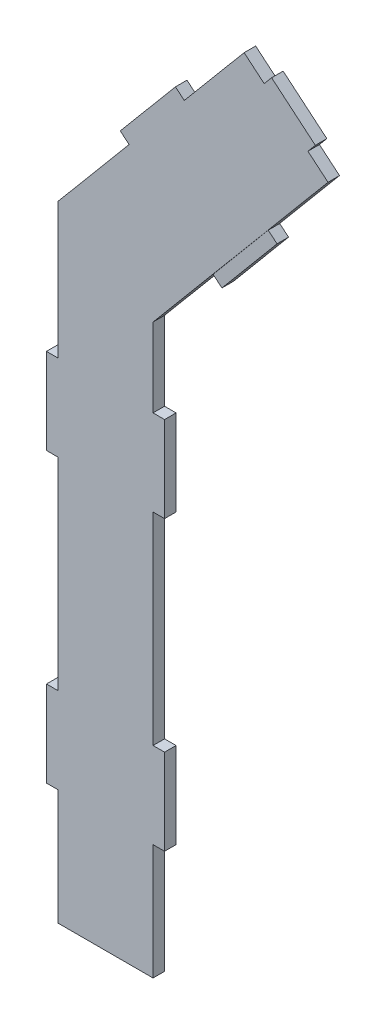
ISO-10303-21;
HEADER;
FILE_DESCRIPTION(('STEP AP214'),'2;1');
FILE_NAME('part.step','',(''),(''),'','','');
FILE_SCHEMA(('AUTOMOTIVE_DESIGN { 1 0 10303 214 1 1 1 1 }'));
ENDSEC;
DATA;
#1=APPLICATION_CONTEXT('core data for automotive mechanical design processes');
#2=APPLICATION_PROTOCOL_DEFINITION('international standard','automotive_design',2000,#1);
#3=PRODUCT_CONTEXT('',#1,'mechanical');
#4=PRODUCT('Part','Part','',(#3));
#5=PRODUCT_RELATED_PRODUCT_CATEGORY('part','',(#4));
#6=PRODUCT_DEFINITION_FORMATION('','',#4);
#7=PRODUCT_DEFINITION_CONTEXT('part definition',#1,'design');
#8=PRODUCT_DEFINITION('design','',#6,#7);
#9=PRODUCT_DEFINITION_SHAPE('','',#8);
#10=(LENGTH_UNIT() NAMED_UNIT(*) SI_UNIT(.MILLI.,.METRE.));
#11=(NAMED_UNIT(*) PLANE_ANGLE_UNIT() SI_UNIT($,.RADIAN.));
#12=(NAMED_UNIT(*) SI_UNIT($,.STERADIAN.) SOLID_ANGLE_UNIT());
#13=UNCERTAINTY_MEASURE_WITH_UNIT(LENGTH_MEASURE(1.E-05),#10,'distance_accuracy_value','');
#14=(GEOMETRIC_REPRESENTATION_CONTEXT(3) GLOBAL_UNCERTAINTY_ASSIGNED_CONTEXT((#13)) GLOBAL_UNIT_ASSIGNED_CONTEXT((#10,
#11,#12)) REPRESENTATION_CONTEXT('',''));
#15=CARTESIAN_POINT('',(0.,0.,0.));
#16=DIRECTION('',(0.,0.,1.));
#17=DIRECTION('',(1.,0.,0.));
#18=AXIS2_PLACEMENT_3D('',#15,#16,#17);
#19=CARTESIAN_POINT('',(75.2950598994498,89.9217180340493,2.));
#20=DIRECTION('',(0.641995610702937,0.766708312096695,0.));
#21=DIRECTION('',(-0.766708312096695,0.641995610702937,0.));
#22=AXIS2_PLACEMENT_3D('',#19,#20,#21);
#23=PLANE('',#22);
#24=DIRECTION('',(0.766708312096695,-0.641995610702937,0.));
#25=VECTOR('',#24,1.);
#26=CARTESIAN_POINT('',(75.2950598994498,89.9217180340493,0.));
#27=LINE('',#26,#25);
#28=CARTESIAN_POINT('',(36.4913656949544,122.413607016209,0.));
#29=VERTEX_POINT('',#28);
#30=CARTESIAN_POINT('',(38.0247823191478,121.129615794803,0.));
#31=VERTEX_POINT('',#30);
#32=EDGE_CURVE('E214',#29,#31,#27,.T.);
#33=ORIENTED_EDGE('',*,*,#32,.F.);
#34=DIRECTION('',(0.,0.,-1.));
#35=VECTOR('',#34,1.);
#36=CARTESIAN_POINT('',(36.4913656949544,122.413607016209,2.));
#37=LINE('',#36,#35);
#38=CARTESIAN_POINT('',(36.4913656949544,122.413607016209,2.));
#39=VERTEX_POINT('',#38);
#40=EDGE_CURVE('E13',#39,#29,#37,.T.);
#41=ORIENTED_EDGE('',*,*,#40,.F.);
#42=DIRECTION('',(0.766708312096695,-0.641995610702937,0.));
#43=VECTOR('',#42,1.);
#44=CARTESIAN_POINT('',(75.2950598994498,89.9217180340493,2.));
#45=LINE('',#44,#43);
#46=CARTESIAN_POINT('',(38.0247823191478,121.129615794803,2.));
#47=VERTEX_POINT('',#46);
#48=EDGE_CURVE('E202',#39,#47,#45,.T.);
#49=ORIENTED_EDGE('',*,*,#48,.T.);
#50=DIRECTION('',(0.,0.,-1.));
#51=VECTOR('',#50,1.);
#52=CARTESIAN_POINT('',(38.0247823191478,121.129615794803,2.));
#53=LINE('',#52,#51);
#54=EDGE_CURVE('E191',#47,#31,#53,.T.);
#55=ORIENTED_EDGE('',*,*,#54,.T.);
#56=EDGE_LOOP('',(#33,#41,#49,#55));
#57=FACE_BOUND('',#56,.T.);
#58=ADVANCED_FACE('F152',(#57),#23,.T.);
#59=CARTESIAN_POINT('',(-38.803694204496,32.4918889821611,2.));
#60=DIRECTION('',(0.766708312096689,-0.641995610702945,0.));
#61=DIRECTION('',(0.641995610702945,0.766708312096689,0.));
#62=AXIS2_PLACEMENT_3D('',#59,#60,#61);
#63=PLANE('',#62);
#64=DIRECTION('',(-0.641995610702945,-0.766708312096689,0.));
#65=VECTOR('',#64,1.);
#66=CARTESIAN_POINT('',(-38.803694204496,32.4918889821611,0.));
#67=LINE('',#66,#65);
#68=CARTESIAN_POINT('',(26.9256310954805,110.989653165969,0.));
#69=VERTEX_POINT('',#68);
#70=EDGE_CURVE('E207',#29,#69,#67,.T.);
#71=ORIENTED_EDGE('',*,*,#70,.T.);
#72=DIRECTION('',(0.,0.,-1.));
#73=VECTOR('',#72,1.);
#74=CARTESIAN_POINT('',(26.9256310954805,110.989653165969,2.));
#75=LINE('',#74,#73);
#76=CARTESIAN_POINT('',(26.9256310954805,110.989653165969,2.));
#77=VERTEX_POINT('',#76);
#78=EDGE_CURVE('E160',#77,#69,#75,.T.);
#79=ORIENTED_EDGE('',*,*,#78,.F.);
#80=DIRECTION('',(-0.641995610702945,-0.766708312096689,0.));
#81=VECTOR('',#80,1.);
#82=CARTESIAN_POINT('',(-38.803694204496,32.4918889821611,2.));
#83=LINE('',#82,#81);
#84=EDGE_CURVE('E197',#39,#77,#83,.T.);
#85=ORIENTED_EDGE('',*,*,#84,.F.);
#86=ORIENTED_EDGE('',*,*,#40,.T.);
#87=EDGE_LOOP('',(#71,#79,#85,#86));
#88=FACE_BOUND('',#87,.T.);
#89=ADVANCED_FACE('F205',(#88),#63,.F.);
#90=CARTESIAN_POINT('',(65.7293252999762,78.4977641838082,2.));
#91=DIRECTION('',(0.641995610702939,0.766708312096694,0.));
#92=DIRECTION('',(-0.766708312096694,0.641995610702939,0.));
#93=AXIS2_PLACEMENT_3D('',#90,#91,#92);
#94=PLANE('',#93);
#95=DIRECTION('',(0.766708312096693,-0.641995610702939,0.));
#96=VECTOR('',#95,1.);
#97=CARTESIAN_POINT('',(65.7293252999762,78.4977641838082,0.));
#98=LINE('',#97,#96);
#99=CARTESIAN_POINT('',(28.4590477196739,109.705661944563,0.));
#100=VERTEX_POINT('',#99);
#101=EDGE_CURVE('E184',#69,#100,#98,.T.);
#102=ORIENTED_EDGE('',*,*,#101,.T.);
#103=DIRECTION('',(0.,0.,-1.));
#104=VECTOR('',#103,1.);
#105=CARTESIAN_POINT('',(28.4590477196739,109.705661944563,2.));
#106=LINE('',#105,#104);
#107=CARTESIAN_POINT('',(28.4590477196739,109.705661944563,2.));
#108=VERTEX_POINT('',#107);
#109=EDGE_CURVE('E208',#108,#100,#106,.T.);
#110=ORIENTED_EDGE('',*,*,#109,.F.);
#111=DIRECTION('',(0.766708312096693,-0.641995610702939,0.));
#112=VECTOR('',#111,1.);
#113=CARTESIAN_POINT('',(65.7293252999762,78.4977641838082,2.));
#114=LINE('',#113,#112);
#115=EDGE_CURVE('E201',#77,#108,#114,.T.);
#116=ORIENTED_EDGE('',*,*,#115,.F.);
#117=ORIENTED_EDGE('',*,*,#78,.T.);
#118=EDGE_LOOP('',(#102,#110,#116,#117));
#119=FACE_BOUND('',#118,.T.);
#120=ADVANCED_FACE('F209',(#119),#94,.F.);
#121=CARTESIAN_POINT('',(-37.2702775803026,31.2078977607551,2.));
#122=DIRECTION('',(-0.766708312096689,0.641995610702944,0.));
#123=DIRECTION('',(-0.641995610702944,-0.766708312096689,0.));
#124=AXIS2_PLACEMENT_3D('',#121,#122,#123);
#125=PLANE('',#124);
#126=DIRECTION('',(0.641995610702944,0.766708312096689,0.));
#127=VECTOR('',#126,1.);
#128=CARTESIAN_POINT('',(-37.2702775803026,31.2078977607551,0.));
#129=LINE('',#128,#127);
#130=EDGE_CURVE('E219',#100,#31,#129,.T.);
#131=ORIENTED_EDGE('',*,*,#130,.T.);
#132=ORIENTED_EDGE('',*,*,#54,.F.);
#133=DIRECTION('',(0.641995610702944,0.766708312096689,0.));
#134=VECTOR('',#133,1.);
#135=CARTESIAN_POINT('',(-37.2702775803026,31.2078977607551,2.));
#136=LINE('',#135,#134);
#137=EDGE_CURVE('E168',#108,#47,#136,.T.);
#138=ORIENTED_EDGE('',*,*,#137,.F.);
#139=ORIENTED_EDGE('',*,*,#109,.T.);
#140=EDGE_LOOP('',(#131,#132,#138,#139));
#141=FACE_BOUND('',#140,.T.);
#142=ADVANCED_FACE('F224',(#141),#125,.F.);
#143=CARTESIAN_POINT('',(0.,0.,2.));
#144=DIRECTION('',(0.,0.,1.));
#145=DIRECTION('',(1.,0.,0.));
#146=AXIS2_PLACEMENT_3D('',#143,#144,#145);
#147=PLANE('',#146);
#148=ORIENTED_EDGE('',*,*,#48,.F.);
#149=ORIENTED_EDGE('',*,*,#84,.T.);
#150=ORIENTED_EDGE('',*,*,#115,.T.);
#151=ORIENTED_EDGE('',*,*,#137,.T.);
#152=EDGE_LOOP('',(#148,#149,#150,#151));
#153=FACE_BOUND('',#152,.T.);
#154=ADVANCED_FACE('F199',(#153),#147,.T.);
#155=CARTESIAN_POINT('',(0.,0.,0.));
#156=DIRECTION('',(0.,0.,1.));
#157=DIRECTION('',(1.,0.,0.));
#158=AXIS2_PLACEMENT_3D('',#155,#156,#157);
#159=PLANE('',#158);
#160=ORIENTED_EDGE('',*,*,#32,.T.);
#161=ORIENTED_EDGE('',*,*,#130,.F.);
#162=ORIENTED_EDGE('',*,*,#101,.F.);
#163=ORIENTED_EDGE('',*,*,#70,.F.);
#164=EDGE_LOOP('',(#160,#161,#162,#163));
#165=FACE_BOUND('',#164,.T.);
#166=ADVANCED_FACE('F226',(#165),#159,.F.);
#167=CLOSED_SHELL('',(#58,#89,#120,#142,#154,#166));
#168=MANIFOLD_SOLID_BREP('B2',#167);
#169=CARTESIAN_POINT('',(85.7090829484666,102.251361125689,2.));
#170=DIRECTION('',(0.642391695952787,0.766376479917607,0.));
#171=DIRECTION('',(-0.766376479917607,0.642391695952787,0.));
#172=AXIS2_PLACEMENT_3D('',#169,#170,#171);
#173=PLANE('',#172);
#174=DIRECTION('',(0.766376479917607,-0.642391695952787,0.));
#175=VECTOR('',#174,1.);
#176=CARTESIAN_POINT('',(85.7090829484666,102.251361125689,0.));
#177=LINE('',#176,#175);
#178=CARTESIAN_POINT('',(43.3847015740639,137.728482153957,0.));
#179=VERTEX_POINT('',#178);
#180=CARTESIAN_POINT('',(46.871714557689,134.805599937372,0.));
#181=VERTEX_POINT('',#180);
#182=EDGE_CURVE('E515',#179,#181,#177,.T.);
#183=ORIENTED_EDGE('',*,*,#182,.F.);
#184=DIRECTION('',(0.,0.,-1.));
#185=VECTOR('',#184,1.);
#186=CARTESIAN_POINT('',(43.3847015740639,137.728482153957,2.));
#187=LINE('',#186,#185);
#188=CARTESIAN_POINT('',(43.3847015740639,137.728482153957,2.));
#189=VERTEX_POINT('',#188);
#190=EDGE_CURVE('E150',#189,#179,#187,.T.);
#191=ORIENTED_EDGE('',*,*,#190,.F.);
#192=DIRECTION('',(0.766376479917607,-0.642391695952787,0.));
#193=VECTOR('',#192,1.);
#194=CARTESIAN_POINT('',(85.7090829484666,102.251361125689,2.));
#195=LINE('',#194,#193);
#196=CARTESIAN_POINT('',(46.871714557689,134.805599937372,2.));
#197=VERTEX_POINT('',#196);
#198=EDGE_CURVE('E593',#189,#197,#195,.T.);
#199=ORIENTED_EDGE('',*,*,#198,.T.);
#200=DIRECTION('',(0.,0.,-1.));
#201=VECTOR('',#200,1.);
#202=CARTESIAN_POINT('',(46.871714557689,134.805599937372,2.));
#203=LINE('',#202,#201);
#204=EDGE_CURVE('E403',#197,#181,#203,.T.);
#205=ORIENTED_EDGE('',*,*,#204,.T.);
#206=EDGE_LOOP('',(#183,#191,#199,#205));
#207=FACE_BOUND('',#206,.T.);
#208=ADVANCED_FACE('F287',(#207),#173,.T.);
#209=CARTESIAN_POINT('',(-42.324381374403,35.4771210282688,2.));
#210=DIRECTION('',(-0.766376479917604,0.64239169595279,0.));
#211=DIRECTION('',(-0.64239169595279,-0.766376479917604,0.));
#212=AXIS2_PLACEMENT_3D('',#209,#210,#211);
#213=PLANE('',#212);
#214=DIRECTION('',(0.64239169595279,0.766376479917604,0.));
#215=VECTOR('',#214,1.);
#216=CARTESIAN_POINT('',(-42.324381374403,35.4771210282688,0.));
#217=LINE('',#216,#215);
#218=CARTESIAN_POINT('',(44.6694849659695,139.261235113792,0.));
#219=VERTEX_POINT('',#218);
#220=EDGE_CURVE('E518',#179,#219,#217,.T.);
#221=ORIENTED_EDGE('',*,*,#220,.T.);
#222=DIRECTION('',(0.,0.,-1.));
#223=VECTOR('',#222,1.);
#224=CARTESIAN_POINT('',(44.6694849659695,139.261235113792,2.));
#225=LINE('',#224,#223);
#226=CARTESIAN_POINT('',(44.6694849659695,139.261235113792,2.));
#227=VERTEX_POINT('',#226);
#228=EDGE_CURVE('E295',#227,#219,#225,.T.);
#229=ORIENTED_EDGE('',*,*,#228,.F.);
#230=DIRECTION('',(0.64239169595279,0.766376479917604,0.));
#231=VECTOR('',#230,1.);
#232=CARTESIAN_POINT('',(-42.324381374403,35.4771210282688,2.));
#233=LINE('',#232,#231);
#234=EDGE_CURVE('E670',#189,#227,#233,.T.);
#235=ORIENTED_EDGE('',*,*,#234,.F.);
#236=ORIENTED_EDGE('',*,*,#190,.T.);
#237=EDGE_LOOP('',(#221,#229,#235,#236));
#238=FACE_BOUND('',#237,.T.);
#239=ADVANCED_FACE('F658',(#238),#213,.F.);
#240=CARTESIAN_POINT('',(86.9938663403723,103.784114085524,2.));
#241=DIRECTION('',(0.642391695952788,0.766376479917606,0.));
#242=DIRECTION('',(-0.766376479917606,0.642391695952788,0.));
#243=AXIS2_PLACEMENT_3D('',#240,#241,#242);
#244=PLANE('',#243);
#245=DIRECTION('',(0.766376479917606,-0.642391695952788,0.));
#246=VECTOR('',#245,1.);
#247=CARTESIAN_POINT('',(86.9938663403723,103.784114085524,0.));
#248=LINE('',#247,#246);
#249=CARTESIAN_POINT('',(37.0823578147852,145.620912903725,0.));
#250=VERTEX_POINT('',#249);
#251=EDGE_CURVE('E521',#250,#219,#248,.T.);
#252=ORIENTED_EDGE('',*,*,#251,.F.);
#253=DIRECTION('',(0.,0.,-1.));
#254=VECTOR('',#253,1.);
#255=CARTESIAN_POINT('',(37.0823578147852,145.620912903725,2.));
#256=LINE('',#255,#254);
#257=CARTESIAN_POINT('',(37.0823578147852,145.620912903725,2.));
#258=VERTEX_POINT('',#257);
#259=EDGE_CURVE('E648',#258,#250,#256,.T.);
#260=ORIENTED_EDGE('',*,*,#259,.F.);
#261=DIRECTION('',(0.766376479917606,-0.642391695952788,0.));
#262=VECTOR('',#261,1.);
#263=CARTESIAN_POINT('',(86.9938663403723,103.784114085524,2.));
#264=LINE('',#263,#262);
#265=EDGE_CURVE('E655',#258,#227,#264,.T.);
#266=ORIENTED_EDGE('',*,*,#265,.T.);
#267=ORIENTED_EDGE('',*,*,#228,.T.);
#268=EDGE_LOOP('',(#252,#260,#266,#267));
#269=FACE_BOUND('',#268,.T.);
#270=ADVANCED_FACE('F653',(#269),#244,.T.);
#271=CARTESIAN_POINT('',(-49.9115085255874,41.8367988182018,2.));
#272=DIRECTION('',(-0.766376479917602,0.642391695952792,0.));
#273=DIRECTION('',(-0.642391695952792,-0.766376479917602,0.));
#274=AXIS2_PLACEMENT_3D('',#271,#272,#273);
#275=PLANE('',#274);
#276=DIRECTION('',(0.642391695952792,0.766376479917602,0.));
#277=VECTOR('',#276,1.);
#278=CARTESIAN_POINT('',(-49.9115085255874,41.8367988182018,0.));
#279=LINE('',#278,#277);
#280=CARTESIAN_POINT('',(35.7975744228796,144.088159943889,0.));
#281=VERTEX_POINT('',#280);
#282=EDGE_CURVE('E524',#281,#250,#279,.T.);
#283=ORIENTED_EDGE('',*,*,#282,.F.);
#284=DIRECTION('',(0.,0.,-1.));
#285=VECTOR('',#284,1.);
#286=CARTESIAN_POINT('',(35.7975744228796,144.088159943889,2.));
#287=LINE('',#286,#285);
#288=CARTESIAN_POINT('',(35.7975744228796,144.088159943889,2.));
#289=VERTEX_POINT('',#288);
#290=EDGE_CURVE('E646',#289,#281,#287,.T.);
#291=ORIENTED_EDGE('',*,*,#290,.F.);
#292=DIRECTION('',(0.642391695952792,0.766376479917602,0.));
#293=VECTOR('',#292,1.);
#294=CARTESIAN_POINT('',(-49.9115085255874,41.8367988182018,2.));
#295=LINE('',#294,#293);
#296=EDGE_CURVE('E667',#289,#258,#295,.T.);
#297=ORIENTED_EDGE('',*,*,#296,.T.);
#298=ORIENTED_EDGE('',*,*,#259,.T.);
#299=EDGE_LOOP('',(#283,#291,#297,#298));
#300=FACE_BOUND('',#299,.T.);
#301=ADVANCED_FACE('F664',(#300),#275,.T.);
#302=CARTESIAN_POINT('',(85.7090829484668,102.251361125688,2.));
#303=DIRECTION('',(0.64239169595279,0.766376479917604,0.));
#304=DIRECTION('',(-0.766376479917604,0.64239169595279,0.));
#305=AXIS2_PLACEMENT_3D('',#302,#303,#304);
#306=PLANE('',#305);
#307=DIRECTION('',(0.766376479917604,-0.64239169595279,0.));
#308=VECTOR('',#307,1.);
#309=CARTESIAN_POINT('',(85.7090829484668,102.251361125688,0.));
#310=LINE('',#309,#308);
#311=CARTESIAN_POINT('',(32.3129331389424,147.009054155591,0.));
#312=VERTEX_POINT('',#311);
#313=EDGE_CURVE('E527',#312,#281,#310,.T.);
#314=ORIENTED_EDGE('',*,*,#313,.F.);
#315=DIRECTION('',(0.,0.,-1.));
#316=VECTOR('',#315,1.);
#317=CARTESIAN_POINT('',(32.3129331389424,147.009054155591,2.));
#318=LINE('',#317,#316);
#319=CARTESIAN_POINT('',(32.3129331389424,147.009054155591,2.));
#320=VERTEX_POINT('',#319);
#321=EDGE_CURVE('E644',#320,#312,#318,.T.);
#322=ORIENTED_EDGE('',*,*,#321,.F.);
#323=DIRECTION('',(0.766376479917604,-0.64239169595279,0.));
#324=VECTOR('',#323,1.);
#325=CARTESIAN_POINT('',(85.7090829484668,102.251361125688,2.));
#326=LINE('',#325,#324);
#327=EDGE_CURVE('E672',#320,#289,#326,.T.);
#328=ORIENTED_EDGE('',*,*,#327,.T.);
#329=ORIENTED_EDGE('',*,*,#290,.T.);
#330=EDGE_LOOP('',(#314,#322,#328,#329));
#331=FACE_BOUND('',#330,.T.);
#332=ADVANCED_FACE('F753',(#331),#306,.T.);
#333=CARTESIAN_POINT('',(-53.4258206009123,44.8295863615691,2.));
#334=DIRECTION('',(-0.766044443118978,0.64278760968654,0.));
#335=DIRECTION('',(-0.64278760968654,-0.766044443118978,0.));
#336=AXIS2_PLACEMENT_3D('',#333,#334,#335);
#337=PLANE('',#336);
#338=DIRECTION('',(0.64278760968654,0.766044443118978,0.));
#339=VECTOR('',#338,1.);
#340=CARTESIAN_POINT('',(-53.4258206009123,44.8295863615691,0.));
#341=LINE('',#340,#339);
#342=CARTESIAN_POINT('',(21.9221531666117,134.62580479371,0.));
#343=VERTEX_POINT('',#342);
#344=EDGE_CURVE('E530',#343,#312,#341,.T.);
#345=ORIENTED_EDGE('',*,*,#344,.F.);
#346=DIRECTION('',(0.,0.,-1.));
#347=VECTOR('',#346,1.);
#348=CARTESIAN_POINT('',(21.9221531666117,134.62580479371,2.));
#349=LINE('',#348,#347);
#350=CARTESIAN_POINT('',(21.9221531666117,134.62580479371,2.));
#351=VERTEX_POINT('',#350);
#352=EDGE_CURVE('E642',#351,#343,#349,.T.);
#353=ORIENTED_EDGE('',*,*,#352,.F.);
#354=DIRECTION('',(0.64278760968654,0.766044443118978,0.));
#355=VECTOR('',#354,1.);
#356=CARTESIAN_POINT('',(-53.4258206009123,44.8295863615691,2.));
#357=LINE('',#356,#355);
#358=EDGE_CURVE('E678',#351,#320,#357,.T.);
#359=ORIENTED_EDGE('',*,*,#358,.T.);
#360=ORIENTED_EDGE('',*,*,#321,.T.);
#361=EDGE_LOOP('',(#345,#353,#359,#360));
#362=FACE_BOUND('',#361,.T.);
#363=ADVANCED_FACE('F756',(#362),#337,.T.);
#364=CARTESIAN_POINT('',(75.3479737675246,89.7962184321393,2.));
#365=DIRECTION('',(-0.642787609686549,-0.76604444311897,0.));
#366=DIRECTION('',(0.76604444311897,-0.642787609686549,0.));
#367=AXIS2_PLACEMENT_3D('',#364,#365,#366);
#368=PLANE('',#367);
#369=DIRECTION('',(-0.76604444311897,0.642787609686549,0.));
#370=VECTOR('',#369,1.);
#371=CARTESIAN_POINT('',(75.3479737675246,89.7962184321393,0.));
#372=LINE('',#371,#370);
#373=CARTESIAN_POINT('',(20.3900642803738,135.911380013083,0.));
#374=VERTEX_POINT('',#373);
#375=EDGE_CURVE('E533',#343,#374,#372,.T.);
#376=ORIENTED_EDGE('',*,*,#375,.T.);
#377=DIRECTION('',(0.,0.,-1.));
#378=VECTOR('',#377,1.);
#379=CARTESIAN_POINT('',(20.3900642803738,135.911380013083,2.));
#380=LINE('',#379,#378);
#381=CARTESIAN_POINT('',(20.3900642803738,135.911380013083,2.));
#382=VERTEX_POINT('',#381);
#383=EDGE_CURVE('E640',#382,#374,#380,.T.);
#384=ORIENTED_EDGE('',*,*,#383,.F.);
#385=DIRECTION('',(-0.76604444311897,0.642787609686549,0.));
#386=VECTOR('',#385,1.);
#387=CARTESIAN_POINT('',(75.3479737675246,89.7962184321393,2.));
#388=LINE('',#387,#386);
#389=EDGE_CURVE('E681',#351,#382,#388,.T.);
#390=ORIENTED_EDGE('',*,*,#389,.F.);
#391=ORIENTED_EDGE('',*,*,#352,.T.);
#392=EDGE_LOOP('',(#376,#384,#390,#391));
#393=FACE_BOUND('',#392,.T.);
#394=ADVANCED_FACE('F760',(#393),#368,.F.);
#395=CARTESIAN_POINT('',(-54.9579094871503,46.1151615809423,2.));
#396=DIRECTION('',(-0.766044443118977,0.642787609686541,0.));
#397=DIRECTION('',(-0.642787609686541,-0.766044443118977,0.));
#398=AXIS2_PLACEMENT_3D('',#395,#396,#397);
#399=PLANE('',#398);
#400=DIRECTION('',(0.64278760968654,0.766044443118977,0.));
#401=VECTOR('',#400,1.);
#402=CARTESIAN_POINT('',(-54.9579094871503,46.1151615809423,0.));
#403=LINE('',#402,#401);
#404=CARTESIAN_POINT('',(10.8125288960443,124.49731781061,0.));
#405=VERTEX_POINT('',#404);
#406=EDGE_CURVE('E536',#405,#374,#403,.T.);
#407=ORIENTED_EDGE('',*,*,#406,.F.);
#408=DIRECTION('',(0.,0.,-1.));
#409=VECTOR('',#408,1.);
#410=CARTESIAN_POINT('',(10.8125288960443,124.49731781061,2.));
#411=LINE('',#410,#409);
#412=CARTESIAN_POINT('',(10.8125288960443,124.49731781061,2.));
#413=VERTEX_POINT('',#412);
#414=EDGE_CURVE('E638',#413,#405,#411,.T.);
#415=ORIENTED_EDGE('',*,*,#414,.F.);
#416=DIRECTION('',(0.64278760968654,0.766044443118977,0.));
#417=VECTOR('',#416,1.);
#418=CARTESIAN_POINT('',(-54.9579094871503,46.1151615809423,2.));
#419=LINE('',#418,#417);
#420=EDGE_CURVE('E683',#413,#382,#419,.T.);
#421=ORIENTED_EDGE('',*,*,#420,.T.);
#422=ORIENTED_EDGE('',*,*,#383,.T.);
#423=EDGE_LOOP('',(#407,#415,#421,#422));
#424=FACE_BOUND('',#423,.T.);
#425=ADVANCED_FACE('F764',(#424),#399,.T.);
#426=CARTESIAN_POINT('',(65.7704383831946,78.382156229668,2.));
#427=DIRECTION('',(-0.642787609686541,-0.766044443118977,0.));
#428=DIRECTION('',(0.766044443118977,-0.642787609686541,0.));
#429=AXIS2_PLACEMENT_3D('',#426,#427,#428);
#430=PLANE('',#429);
#431=DIRECTION('',(-0.766044443118977,0.642787609686541,0.));
#432=VECTOR('',#431,1.);
#433=CARTESIAN_POINT('',(65.7704383831946,78.382156229668,0.));
#434=LINE('',#433,#432);
#435=CARTESIAN_POINT('',(12.3446177822823,123.211742591237,0.));
#436=VERTEX_POINT('',#435);
#437=EDGE_CURVE('E539',#436,#405,#434,.T.);
#438=ORIENTED_EDGE('',*,*,#437,.F.);
#439=DIRECTION('',(0.,0.,-1.));
#440=VECTOR('',#439,1.);
#441=CARTESIAN_POINT('',(12.3446177822823,123.211742591237,2.));
#442=LINE('',#441,#440);
#443=CARTESIAN_POINT('',(12.3446177822823,123.211742591237,2.));
#444=VERTEX_POINT('',#443);
#445=EDGE_CURVE('E636',#444,#436,#442,.T.);
#446=ORIENTED_EDGE('',*,*,#445,.F.);
#447=DIRECTION('',(-0.766044443118977,0.642787609686541,0.));
#448=VECTOR('',#447,1.);
#449=CARTESIAN_POINT('',(65.7704383831946,78.382156229668,2.));
#450=LINE('',#449,#448);
#451=EDGE_CURVE('E686',#444,#413,#450,.T.);
#452=ORIENTED_EDGE('',*,*,#451,.T.);
#453=ORIENTED_EDGE('',*,*,#414,.T.);
#454=EDGE_LOOP('',(#438,#446,#452,#453));
#455=FACE_BOUND('',#454,.T.);
#456=ADVANCED_FACE('F768',(#455),#430,.T.);
#457=CARTESIAN_POINT('',(-53.4258206009123,44.8295863615693,2.));
#458=DIRECTION('',(-0.766044443118976,0.642787609686541,0.));
#459=DIRECTION('',(-0.642787609686541,-0.766044443118976,0.));
#460=AXIS2_PLACEMENT_3D('',#457,#458,#459);
#461=PLANE('',#460);
#462=DIRECTION('',(0.642787609686541,0.766044443118976,0.));
#463=VECTOR('',#462,1.);
#464=CARTESIAN_POINT('',(-53.4258206009123,44.8295863615693,0.));
#465=LINE('',#464,#463);
#466=CARTESIAN_POINT('',(0.,108.5,0.));
#467=VERTEX_POINT('',#466);
#468=EDGE_CURVE('E542',#467,#436,#465,.T.);
#469=ORIENTED_EDGE('',*,*,#468,.F.);
#470=DIRECTION('',(0.,0.,-1.));
#471=VECTOR('',#470,1.);
#472=CARTESIAN_POINT('',(0.,108.5,2.));
#473=LINE('',#472,#471);
#474=CARTESIAN_POINT('',(0.,108.5,2.));
#475=VERTEX_POINT('',#474);
#476=EDGE_CURVE('E634',#475,#467,#473,.T.);
#477=ORIENTED_EDGE('',*,*,#476,.F.);
#478=DIRECTION('',(0.642787609686541,0.766044443118976,0.));
#479=VECTOR('',#478,1.);
#480=CARTESIAN_POINT('',(-53.4258206009123,44.8295863615693,2.));
#481=LINE('',#480,#479);
#482=EDGE_CURVE('E689',#475,#444,#481,.T.);
#483=ORIENTED_EDGE('',*,*,#482,.T.);
#484=ORIENTED_EDGE('',*,*,#445,.T.);
#485=EDGE_LOOP('',(#469,#477,#483,#484));
#486=FACE_BOUND('',#485,.T.);
#487=ADVANCED_FACE('F772',(#486),#461,.T.);
#488=CARTESIAN_POINT('',(0.,0.,2.));
#489=DIRECTION('',(-1.,0.,0.));
#490=DIRECTION('',(0.,-1.,0.));
#491=AXIS2_PLACEMENT_3D('',#488,#489,#490);
#492=PLANE('',#491);
#493=DIRECTION('',(0.,1.,0.));
#494=VECTOR('',#493,1.);
#495=CARTESIAN_POINT('',(0.,0.,0.));
#496=LINE('',#495,#494);
#497=CARTESIAN_POINT('',(0.,84.95,0.));
#498=VERTEX_POINT('',#497);
#499=EDGE_CURVE('E545',#498,#467,#496,.T.);
#500=ORIENTED_EDGE('',*,*,#499,.F.);
#501=DIRECTION('',(0.,0.,-1.));
#502=VECTOR('',#501,1.);
#503=CARTESIAN_POINT('',(0.,84.95,2.));
#504=LINE('',#503,#502);
#505=CARTESIAN_POINT('',(0.,84.95,2.));
#506=VERTEX_POINT('',#505);
#507=EDGE_CURVE('E632',#506,#498,#504,.T.);
#508=ORIENTED_EDGE('',*,*,#507,.F.);
#509=DIRECTION('',(0.,1.,0.));
#510=VECTOR('',#509,1.);
#511=CARTESIAN_POINT('',(0.,0.,2.));
#512=LINE('',#511,#510);
#513=EDGE_CURVE('E692',#506,#475,#512,.T.);
#514=ORIENTED_EDGE('',*,*,#513,.T.);
#515=ORIENTED_EDGE('',*,*,#476,.T.);
#516=EDGE_LOOP('',(#500,#508,#514,#515));
#517=FACE_BOUND('',#516,.T.);
#518=ADVANCED_FACE('F776',(#517),#492,.T.);
#519=CARTESIAN_POINT('',(0.,84.95,2.));
#520=DIRECTION('',(0.,-1.,0.));
#521=DIRECTION('',(0.,0.,-1.));
#522=AXIS2_PLACEMENT_3D('',#519,#520,#521);
#523=PLANE('',#522);
#524=DIRECTION('',(-1.,0.,0.));
#525=VECTOR('',#524,1.);
#526=CARTESIAN_POINT('',(0.,84.95,0.));
#527=LINE('',#526,#525);
#528=CARTESIAN_POINT('',(-2.,84.95,0.));
#529=VERTEX_POINT('',#528);
#530=EDGE_CURVE('E548',#498,#529,#527,.T.);
#531=ORIENTED_EDGE('',*,*,#530,.T.);
#532=DIRECTION('',(0.,0.,-1.));
#533=VECTOR('',#532,1.);
#534=CARTESIAN_POINT('',(-2.,84.95,2.));
#535=LINE('',#534,#533);
#536=CARTESIAN_POINT('',(-2.,84.95,2.));
#537=VERTEX_POINT('',#536);
#538=EDGE_CURVE('E630',#537,#529,#535,.T.);
#539=ORIENTED_EDGE('',*,*,#538,.F.);
#540=DIRECTION('',(-1.,0.,0.));
#541=VECTOR('',#540,1.);
#542=CARTESIAN_POINT('',(0.,84.95,2.));
#543=LINE('',#542,#541);
#544=EDGE_CURVE('E695',#506,#537,#543,.T.);
#545=ORIENTED_EDGE('',*,*,#544,.F.);
#546=ORIENTED_EDGE('',*,*,#507,.T.);
#547=EDGE_LOOP('',(#531,#539,#545,#546));
#548=FACE_BOUND('',#547,.T.);
#549=ADVANCED_FACE('F780',(#548),#523,.F.);
#550=CARTESIAN_POINT('',(-1.99999999999999,0.,2.));
#551=DIRECTION('',(-1.,0.,0.));
#552=DIRECTION('',(0.,-1.,0.));
#553=AXIS2_PLACEMENT_3D('',#550,#551,#552);
#554=PLANE('',#553);
#555=DIRECTION('',(0.,1.,0.));
#556=VECTOR('',#555,1.);
#557=CARTESIAN_POINT('',(-1.99999999999999,0.,0.));
#558=LINE('',#557,#556);
#559=CARTESIAN_POINT('',(-2.,70.05,0.));
#560=VERTEX_POINT('',#559);
#561=EDGE_CURVE('E551',#560,#529,#558,.T.);
#562=ORIENTED_EDGE('',*,*,#561,.F.);
#563=DIRECTION('',(0.,0.,-1.));
#564=VECTOR('',#563,1.);
#565=CARTESIAN_POINT('',(-2.,70.05,2.));
#566=LINE('',#565,#564);
#567=CARTESIAN_POINT('',(-2.,70.05,2.));
#568=VERTEX_POINT('',#567);
#569=EDGE_CURVE('E628',#568,#560,#566,.T.);
#570=ORIENTED_EDGE('',*,*,#569,.F.);
#571=DIRECTION('',(0.,1.,0.));
#572=VECTOR('',#571,1.);
#573=CARTESIAN_POINT('',(-1.99999999999999,0.,2.));
#574=LINE('',#573,#572);
#575=EDGE_CURVE('E697',#568,#537,#574,.T.);
#576=ORIENTED_EDGE('',*,*,#575,.T.);
#577=ORIENTED_EDGE('',*,*,#538,.T.);
#578=EDGE_LOOP('',(#562,#570,#576,#577));
#579=FACE_BOUND('',#578,.T.);
#580=ADVANCED_FACE('F784',(#579),#554,.T.);
#581=CARTESIAN_POINT('',(0.,70.05,2.));
#582=DIRECTION('',(0.,-1.,0.));
#583=DIRECTION('',(0.,0.,-1.));
#584=AXIS2_PLACEMENT_3D('',#581,#582,#583);
#585=PLANE('',#584);
#586=DIRECTION('',(-1.,0.,0.));
#587=VECTOR('',#586,1.);
#588=CARTESIAN_POINT('',(0.,70.05,0.));
#589=LINE('',#588,#587);
#590=CARTESIAN_POINT('',(0.,70.05,0.));
#591=VERTEX_POINT('',#590);
#592=EDGE_CURVE('E554',#591,#560,#589,.T.);
#593=ORIENTED_EDGE('',*,*,#592,.F.);
#594=DIRECTION('',(0.,0.,-1.));
#595=VECTOR('',#594,1.);
#596=CARTESIAN_POINT('',(0.,70.05,2.));
#597=LINE('',#596,#595);
#598=CARTESIAN_POINT('',(0.,70.05,2.));
#599=VERTEX_POINT('',#598);
#600=EDGE_CURVE('E626',#599,#591,#597,.T.);
#601=ORIENTED_EDGE('',*,*,#600,.F.);
#602=DIRECTION('',(-1.,0.,0.));
#603=VECTOR('',#602,1.);
#604=CARTESIAN_POINT('',(0.,70.05,2.));
#605=LINE('',#604,#603);
#606=EDGE_CURVE('E700',#599,#568,#605,.T.);
#607=ORIENTED_EDGE('',*,*,#606,.T.);
#608=ORIENTED_EDGE('',*,*,#569,.T.);
#609=EDGE_LOOP('',(#593,#601,#607,#608));
#610=FACE_BOUND('',#609,.T.);
#611=ADVANCED_FACE('F788',(#610),#585,.T.);
#612=CARTESIAN_POINT('',(0.,0.,2.));
#613=DIRECTION('',(-1.,0.,0.));
#614=DIRECTION('',(0.,-1.,0.));
#615=AXIS2_PLACEMENT_3D('',#612,#613,#614);
#616=PLANE('',#615);
#617=DIRECTION('',(0.,1.,0.));
#618=VECTOR('',#617,1.);
#619=CARTESIAN_POINT('',(0.,0.,0.));
#620=LINE('',#619,#618);
#621=CARTESIAN_POINT('',(0.,34.95,0.));
#622=VERTEX_POINT('',#621);
#623=EDGE_CURVE('E557',#622,#591,#620,.T.);
#624=ORIENTED_EDGE('',*,*,#623,.F.);
#625=DIRECTION('',(0.,0.,-1.));
#626=VECTOR('',#625,1.);
#627=CARTESIAN_POINT('',(0.,34.95,2.));
#628=LINE('',#627,#626);
#629=CARTESIAN_POINT('',(0.,34.95,2.));
#630=VERTEX_POINT('',#629);
#631=EDGE_CURVE('E624',#630,#622,#628,.T.);
#632=ORIENTED_EDGE('',*,*,#631,.F.);
#633=DIRECTION('',(0.,1.,0.));
#634=VECTOR('',#633,1.);
#635=CARTESIAN_POINT('',(0.,0.,2.));
#636=LINE('',#635,#634);
#637=EDGE_CURVE('E703',#630,#599,#636,.T.);
#638=ORIENTED_EDGE('',*,*,#637,.T.);
#639=ORIENTED_EDGE('',*,*,#600,.T.);
#640=EDGE_LOOP('',(#624,#632,#638,#639));
#641=FACE_BOUND('',#640,.T.);
#642=ADVANCED_FACE('F792',(#641),#616,.T.);
#643=CARTESIAN_POINT('',(-1.21257170970779E-13,34.95,2.));
#644=DIRECTION('',(0.,-1.,0.));
#645=DIRECTION('',(1.,0.,0.));
#646=AXIS2_PLACEMENT_3D('',#643,#644,#645);
#647=PLANE('',#646);
#648=DIRECTION('',(-1.,0.,0.));
#649=VECTOR('',#648,1.);
#650=CARTESIAN_POINT('',(-1.21257170970779E-13,34.95,0.));
#651=LINE('',#650,#649);
#652=CARTESIAN_POINT('',(-2.,34.95,0.));
#653=VERTEX_POINT('',#652);
#654=EDGE_CURVE('E560',#622,#653,#651,.T.);
#655=ORIENTED_EDGE('',*,*,#654,.T.);
#656=DIRECTION('',(0.,0.,-1.));
#657=VECTOR('',#656,1.);
#658=CARTESIAN_POINT('',(-2.,34.95,2.));
#659=LINE('',#658,#657);
#660=CARTESIAN_POINT('',(-2.,34.95,2.));
#661=VERTEX_POINT('',#660);
#662=EDGE_CURVE('E622',#661,#653,#659,.T.);
#663=ORIENTED_EDGE('',*,*,#662,.F.);
#664=DIRECTION('',(-1.,0.,0.));
#665=VECTOR('',#664,1.);
#666=CARTESIAN_POINT('',(-1.21257170970779E-13,34.95,2.));
#667=LINE('',#666,#665);
#668=EDGE_CURVE('E706',#630,#661,#667,.T.);
#669=ORIENTED_EDGE('',*,*,#668,.F.);
#670=ORIENTED_EDGE('',*,*,#631,.T.);
#671=EDGE_LOOP('',(#655,#663,#669,#670));
#672=FACE_BOUND('',#671,.T.);
#673=ADVANCED_FACE('F796',(#672),#647,.F.);
#674=CARTESIAN_POINT('',(-2.,0.,2.));
#675=DIRECTION('',(-1.,0.,0.));
#676=DIRECTION('',(0.,-1.,0.));
#677=AXIS2_PLACEMENT_3D('',#674,#675,#676);
#678=PLANE('',#677);
#679=DIRECTION('',(0.,1.,0.));
#680=VECTOR('',#679,1.);
#681=CARTESIAN_POINT('',(-2.,0.,0.));
#682=LINE('',#681,#680);
#683=CARTESIAN_POINT('',(-2.,20.05,0.));
#684=VERTEX_POINT('',#683);
#685=EDGE_CURVE('E563',#684,#653,#682,.T.);
#686=ORIENTED_EDGE('',*,*,#685,.F.);
#687=DIRECTION('',(0.,0.,-1.));
#688=VECTOR('',#687,1.);
#689=CARTESIAN_POINT('',(-2.,20.05,2.));
#690=LINE('',#689,#688);
#691=CARTESIAN_POINT('',(-2.,20.05,2.));
#692=VERTEX_POINT('',#691);
#693=EDGE_CURVE('E620',#692,#684,#690,.T.);
#694=ORIENTED_EDGE('',*,*,#693,.F.);
#695=DIRECTION('',(0.,1.,0.));
#696=VECTOR('',#695,1.);
#697=CARTESIAN_POINT('',(-2.,0.,2.));
#698=LINE('',#697,#696);
#699=EDGE_CURVE('E708',#692,#661,#698,.T.);
#700=ORIENTED_EDGE('',*,*,#699,.T.);
#701=ORIENTED_EDGE('',*,*,#662,.T.);
#702=EDGE_LOOP('',(#686,#694,#700,#701));
#703=FACE_BOUND('',#702,.T.);
#704=ADVANCED_FACE('F800',(#703),#678,.T.);
#705=CARTESIAN_POINT('',(0.,20.05,2.));
#706=DIRECTION('',(0.,-1.,0.));
#707=DIRECTION('',(0.,0.,-1.));
#708=AXIS2_PLACEMENT_3D('',#705,#706,#707);
#709=PLANE('',#708);
#710=DIRECTION('',(-1.,0.,0.));
#711=VECTOR('',#710,1.);
#712=CARTESIAN_POINT('',(0.,20.05,0.));
#713=LINE('',#712,#711);
#714=CARTESIAN_POINT('',(0.,20.05,0.));
#715=VERTEX_POINT('',#714);
#716=EDGE_CURVE('E566',#715,#684,#713,.T.);
#717=ORIENTED_EDGE('',*,*,#716,.F.);
#718=DIRECTION('',(0.,0.,-1.));
#719=VECTOR('',#718,1.);
#720=CARTESIAN_POINT('',(0.,20.05,2.));
#721=LINE('',#720,#719);
#722=CARTESIAN_POINT('',(0.,20.05,2.));
#723=VERTEX_POINT('',#722);
#724=EDGE_CURVE('E618',#723,#715,#721,.T.);
#725=ORIENTED_EDGE('',*,*,#724,.F.);
#726=DIRECTION('',(-1.,0.,0.));
#727=VECTOR('',#726,1.);
#728=CARTESIAN_POINT('',(0.,20.05,2.));
#729=LINE('',#728,#727);
#730=EDGE_CURVE('E711',#723,#692,#729,.T.);
#731=ORIENTED_EDGE('',*,*,#730,.T.);
#732=ORIENTED_EDGE('',*,*,#693,.T.);
#733=EDGE_LOOP('',(#717,#725,#731,#732));
#734=FACE_BOUND('',#733,.T.);
#735=ADVANCED_FACE('F804',(#734),#709,.T.);
#736=CARTESIAN_POINT('',(0.,0.,2.));
#737=DIRECTION('',(-1.,0.,0.));
#738=DIRECTION('',(0.,-1.,0.));
#739=AXIS2_PLACEMENT_3D('',#736,#737,#738);
#740=PLANE('',#739);
#741=DIRECTION('',(0.,1.,0.));
#742=VECTOR('',#741,1.);
#743=CARTESIAN_POINT('',(0.,0.,0.));
#744=LINE('',#743,#742);
#745=CARTESIAN_POINT('',(0.,0.,0.));
#746=VERTEX_POINT('',#745);
#747=EDGE_CURVE('E569',#746,#715,#744,.T.);
#748=ORIENTED_EDGE('',*,*,#747,.F.);
#749=DIRECTION('',(0.,0.,-1.));
#750=VECTOR('',#749,1.);
#751=CARTESIAN_POINT('',(0.,0.,2.));
#752=LINE('',#751,#750);
#753=CARTESIAN_POINT('',(0.,0.,2.));
#754=VERTEX_POINT('',#753);
#755=EDGE_CURVE('E616',#754,#746,#752,.T.);
#756=ORIENTED_EDGE('',*,*,#755,.F.);
#757=DIRECTION('',(0.,1.,0.));
#758=VECTOR('',#757,1.);
#759=CARTESIAN_POINT('',(0.,0.,2.));
#760=LINE('',#759,#758);
#761=EDGE_CURVE('E714',#754,#723,#760,.T.);
#762=ORIENTED_EDGE('',*,*,#761,.T.);
#763=ORIENTED_EDGE('',*,*,#724,.T.);
#764=EDGE_LOOP('',(#748,#756,#762,#763));
#765=FACE_BOUND('',#764,.T.);
#766=ADVANCED_FACE('F808',(#765),#740,.T.);
#767=CARTESIAN_POINT('',(0.,0.,2.));
#768=DIRECTION('',(0.,1.,0.));
#769=DIRECTION('',(0.,0.,1.));
#770=AXIS2_PLACEMENT_3D('',#767,#768,#769);
#771=PLANE('',#770);
#772=DIRECTION('',(1.,0.,0.));
#773=VECTOR('',#772,1.);
#774=CARTESIAN_POINT('',(0.,0.,0.));
#775=LINE('',#774,#773);
#776=CARTESIAN_POINT('',(16.5,0.,0.));
#777=VERTEX_POINT('',#776);
#778=EDGE_CURVE('E572',#746,#777,#775,.T.);
#779=ORIENTED_EDGE('',*,*,#778,.T.);
#780=DIRECTION('',(0.,0.,-1.));
#781=VECTOR('',#780,1.);
#782=CARTESIAN_POINT('',(16.5,0.,2.));
#783=LINE('',#782,#781);
#784=CARTESIAN_POINT('',(16.5,0.,2.));
#785=VERTEX_POINT('',#784);
#786=EDGE_CURVE('E613',#785,#777,#783,.T.);
#787=ORIENTED_EDGE('',*,*,#786,.F.);
#788=DIRECTION('',(1.,0.,0.));
#789=VECTOR('',#788,1.);
#790=CARTESIAN_POINT('',(0.,0.,2.));
#791=LINE('',#790,#789);
#792=EDGE_CURVE('E717',#754,#785,#791,.T.);
#793=ORIENTED_EDGE('',*,*,#792,.F.);
#794=ORIENTED_EDGE('',*,*,#755,.T.);
#795=EDGE_LOOP('',(#779,#787,#793,#794));
#796=FACE_BOUND('',#795,.T.);
#797=ADVANCED_FACE('F812',(#796),#771,.F.);
#798=CARTESIAN_POINT('',(16.5,0.,2.));
#799=DIRECTION('',(-1.,0.,0.));
#800=DIRECTION('',(0.,0.,1.));
#801=AXIS2_PLACEMENT_3D('',#798,#799,#800);
#802=PLANE('',#801);
#803=DIRECTION('',(0.,1.,0.));
#804=VECTOR('',#803,1.);
#805=CARTESIAN_POINT('',(16.5,0.,0.));
#806=LINE('',#805,#804);
#807=CARTESIAN_POINT('',(16.5,20.05,0.));
#808=VERTEX_POINT('',#807);
#809=EDGE_CURVE('E574',#777,#808,#806,.T.);
#810=ORIENTED_EDGE('',*,*,#809,.T.);
#811=DIRECTION('',(0.,0.,-1.));
#812=VECTOR('',#811,1.);
#813=CARTESIAN_POINT('',(16.5,20.05,2.));
#814=LINE('',#813,#812);
#815=CARTESIAN_POINT('',(16.5,20.05,2.));
#816=VERTEX_POINT('',#815);
#817=EDGE_CURVE('E610',#816,#808,#814,.T.);
#818=ORIENTED_EDGE('',*,*,#817,.F.);
#819=DIRECTION('',(0.,1.,0.));
#820=VECTOR('',#819,1.);
#821=CARTESIAN_POINT('',(16.5,0.,2.));
#822=LINE('',#821,#820);
#823=EDGE_CURVE('E504',#785,#816,#822,.T.);
#824=ORIENTED_EDGE('',*,*,#823,.F.);
#825=ORIENTED_EDGE('',*,*,#786,.T.);
#826=EDGE_LOOP('',(#810,#818,#824,#825));
#827=FACE_BOUND('',#826,.T.);
#828=ADVANCED_FACE('F816',(#827),#802,.F.);
#829=CARTESIAN_POINT('',(0.,20.05,2.));
#830=DIRECTION('',(0.,1.,0.));
#831=DIRECTION('',(0.,0.,1.));
#832=AXIS2_PLACEMENT_3D('',#829,#830,#831);
#833=PLANE('',#832);
#834=DIRECTION('',(1.,0.,0.));
#835=VECTOR('',#834,1.);
#836=CARTESIAN_POINT('',(0.,20.05,0.));
#837=LINE('',#836,#835);
#838=CARTESIAN_POINT('',(18.5,20.05,0.));
#839=VERTEX_POINT('',#838);
#840=EDGE_CURVE('E576',#808,#839,#837,.T.);
#841=ORIENTED_EDGE('',*,*,#840,.T.);
#842=DIRECTION('',(0.,0.,-1.));
#843=VECTOR('',#842,1.);
#844=CARTESIAN_POINT('',(18.5,20.05,2.));
#845=LINE('',#844,#843);
#846=CARTESIAN_POINT('',(18.5,20.05,2.));
#847=VERTEX_POINT('',#846);
#848=EDGE_CURVE('E607',#847,#839,#845,.T.);
#849=ORIENTED_EDGE('',*,*,#848,.F.);
#850=DIRECTION('',(1.,0.,0.));
#851=VECTOR('',#850,1.);
#852=CARTESIAN_POINT('',(0.,20.05,2.));
#853=LINE('',#852,#851);
#854=EDGE_CURVE('E719',#816,#847,#853,.T.);
#855=ORIENTED_EDGE('',*,*,#854,.F.);
#856=ORIENTED_EDGE('',*,*,#817,.T.);
#857=EDGE_LOOP('',(#841,#849,#855,#856));
#858=FACE_BOUND('',#857,.T.);
#859=ADVANCED_FACE('F818',(#858),#833,.F.);
#860=CARTESIAN_POINT('',(18.5,0.,2.));
#861=DIRECTION('',(-1.,0.,0.));
#862=DIRECTION('',(0.,-1.,0.));
#863=AXIS2_PLACEMENT_3D('',#860,#861,#862);
#864=PLANE('',#863);
#865=DIRECTION('',(0.,1.,0.));
#866=VECTOR('',#865,1.);
#867=CARTESIAN_POINT('',(18.5,0.,0.));
#868=LINE('',#867,#866);
#869=CARTESIAN_POINT('',(18.5,34.95,0.));
#870=VERTEX_POINT('',#869);
#871=EDGE_CURVE('E579',#839,#870,#868,.T.);
#872=ORIENTED_EDGE('',*,*,#871,.T.);
#873=DIRECTION('',(0.,0.,-1.));
#874=VECTOR('',#873,1.);
#875=CARTESIAN_POINT('',(18.5,34.95,2.));
#876=LINE('',#875,#874);
#877=CARTESIAN_POINT('',(18.5,34.95,2.));
#878=VERTEX_POINT('',#877);
#879=EDGE_CURVE('E605',#878,#870,#876,.T.);
#880=ORIENTED_EDGE('',*,*,#879,.F.);
#881=DIRECTION('',(0.,1.,0.));
#882=VECTOR('',#881,1.);
#883=CARTESIAN_POINT('',(18.5,0.,2.));
#884=LINE('',#883,#882);
#885=EDGE_CURVE('E721',#847,#878,#884,.T.);
#886=ORIENTED_EDGE('',*,*,#885,.F.);
#887=ORIENTED_EDGE('',*,*,#848,.T.);
#888=EDGE_LOOP('',(#872,#880,#886,#887));
#889=FACE_BOUND('',#888,.T.);
#890=ADVANCED_FACE('F821',(#889),#864,.F.);
#891=CARTESIAN_POINT('',(1.21257170970779E-13,34.9500000000001,2.));
#892=DIRECTION('',(0.,1.,0.));
#893=DIRECTION('',(-1.,0.,0.));
#894=AXIS2_PLACEMENT_3D('',#891,#892,#893);
#895=PLANE('',#894);
#896=DIRECTION('',(1.,0.,0.));
#897=VECTOR('',#896,1.);
#898=CARTESIAN_POINT('',(1.21257170970779E-13,34.9500000000001,0.));
#899=LINE('',#898,#897);
#900=CARTESIAN_POINT('',(16.5,34.95,0.));
#901=VERTEX_POINT('',#900);
#902=EDGE_CURVE('E582',#901,#870,#899,.T.);
#903=ORIENTED_EDGE('',*,*,#902,.F.);
#904=DIRECTION('',(0.,0.,-1.));
#905=VECTOR('',#904,1.);
#906=CARTESIAN_POINT('',(16.5,34.95,2.));
#907=LINE('',#906,#905);
#908=CARTESIAN_POINT('',(16.5,34.95,2.));
#909=VERTEX_POINT('',#908);
#910=EDGE_CURVE('E603',#909,#901,#907,.T.);
#911=ORIENTED_EDGE('',*,*,#910,.F.);
#912=DIRECTION('',(1.,0.,0.));
#913=VECTOR('',#912,1.);
#914=CARTESIAN_POINT('',(1.21257170970779E-13,34.9500000000001,2.));
#915=LINE('',#914,#913);
#916=EDGE_CURVE('E723',#909,#878,#915,.T.);
#917=ORIENTED_EDGE('',*,*,#916,.T.);
#918=ORIENTED_EDGE('',*,*,#879,.T.);
#919=EDGE_LOOP('',(#903,#911,#917,#918));
#920=FACE_BOUND('',#919,.T.);
#921=ADVANCED_FACE('F825',(#920),#895,.T.);
#922=CARTESIAN_POINT('',(16.5,70.05,0.));
#923=VERTEX_POINT('',#922);
#924=EDGE_CURVE('E577',#901,#923,#806,.T.);
#925=ORIENTED_EDGE('',*,*,#924,.T.);
#926=DIRECTION('',(0.,0.,-1.));
#927=VECTOR('',#926,1.);
#928=CARTESIAN_POINT('',(16.5,70.05,2.));
#929=LINE('',#928,#927);
#930=CARTESIAN_POINT('',(16.5,70.05,2.));
#931=VERTEX_POINT('',#930);
#932=EDGE_CURVE('E600',#931,#923,#929,.T.);
#933=ORIENTED_EDGE('',*,*,#932,.F.);
#934=EDGE_CURVE('E503',#909,#931,#822,.T.);
#935=ORIENTED_EDGE('',*,*,#934,.F.);
#936=ORIENTED_EDGE('',*,*,#910,.T.);
#937=EDGE_LOOP('',(#925,#933,#935,#936));
#938=FACE_BOUND('',#937,.T.);
#939=ADVANCED_FACE('F731',(#938),#802,.F.);
#940=CARTESIAN_POINT('',(0.,70.05,2.));
#941=DIRECTION('',(0.,1.,0.));
#942=DIRECTION('',(0.,0.,1.));
#943=AXIS2_PLACEMENT_3D('',#940,#941,#942);
#944=PLANE('',#943);
#945=DIRECTION('',(1.,0.,0.));
#946=VECTOR('',#945,1.);
#947=CARTESIAN_POINT('',(0.,70.05,0.));
#948=LINE('',#947,#946);
#949=CARTESIAN_POINT('',(18.5,70.05,0.));
#950=VERTEX_POINT('',#949);
#951=EDGE_CURVE('E585',#923,#950,#948,.T.);
#952=ORIENTED_EDGE('',*,*,#951,.T.);
#953=DIRECTION('',(0.,0.,-1.));
#954=VECTOR('',#953,1.);
#955=CARTESIAN_POINT('',(18.5,70.05,2.));
#956=LINE('',#955,#954);
#957=CARTESIAN_POINT('',(18.5,70.05,2.));
#958=VERTEX_POINT('',#957);
#959=EDGE_CURVE('E597',#958,#950,#956,.T.);
#960=ORIENTED_EDGE('',*,*,#959,.F.);
#961=DIRECTION('',(1.,0.,0.));
#962=VECTOR('',#961,1.);
#963=CARTESIAN_POINT('',(0.,70.05,2.));
#964=LINE('',#963,#962);
#965=EDGE_CURVE('E510',#931,#958,#964,.T.);
#966=ORIENTED_EDGE('',*,*,#965,.F.);
#967=ORIENTED_EDGE('',*,*,#932,.T.);
#968=EDGE_LOOP('',(#952,#960,#966,#967));
#969=FACE_BOUND('',#968,.T.);
#970=ADVANCED_FACE('F735',(#969),#944,.F.);
#971=CARTESIAN_POINT('',(18.5,0.,2.));
#972=DIRECTION('',(-1.,0.,0.));
#973=DIRECTION('',(0.,-1.,0.));
#974=AXIS2_PLACEMENT_3D('',#971,#972,#973);
#975=PLANE('',#974);
#976=DIRECTION('',(0.,1.,0.));
#977=VECTOR('',#976,1.);
#978=CARTESIAN_POINT('',(18.5,0.,0.));
#979=LINE('',#978,#977);
#980=CARTESIAN_POINT('',(18.5,84.95,0.));
#981=VERTEX_POINT('',#980);
#982=EDGE_CURVE('E587',#950,#981,#979,.T.);
#983=ORIENTED_EDGE('',*,*,#982,.T.);
#984=DIRECTION('',(0.,0.,-1.));
#985=VECTOR('',#984,1.);
#986=CARTESIAN_POINT('',(18.5,84.95,2.));
#987=LINE('',#986,#985);
#988=CARTESIAN_POINT('',(18.5,84.95,2.));
#989=VERTEX_POINT('',#988);
#990=EDGE_CURVE('E497',#989,#981,#987,.T.);
#991=ORIENTED_EDGE('',*,*,#990,.F.);
#992=DIRECTION('',(0.,1.,0.));
#993=VECTOR('',#992,1.);
#994=CARTESIAN_POINT('',(18.5,0.,2.));
#995=LINE('',#994,#993);
#996=EDGE_CURVE('E507',#958,#989,#995,.T.);
#997=ORIENTED_EDGE('',*,*,#996,.F.);
#998=ORIENTED_EDGE('',*,*,#959,.T.);
#999=EDGE_LOOP('',(#983,#991,#997,#998));
#1000=FACE_BOUND('',#999,.T.);
#1001=ADVANCED_FACE('F738',(#1000),#975,.F.);
#1002=CARTESIAN_POINT('',(0.,84.95,2.));
#1003=DIRECTION('',(0.,1.,0.));
#1004=DIRECTION('',(0.,0.,1.));
#1005=AXIS2_PLACEMENT_3D('',#1002,#1003,#1004);
#1006=PLANE('',#1005);
#1007=DIRECTION('',(1.,0.,0.));
#1008=VECTOR('',#1007,1.);
#1009=CARTESIAN_POINT('',(0.,84.95,0.));
#1010=LINE('',#1009,#1008);
#1011=CARTESIAN_POINT('',(16.5,84.95,0.));
#1012=VERTEX_POINT('',#1011);
#1013=EDGE_CURVE('E496',#1012,#981,#1010,.T.);
#1014=ORIENTED_EDGE('',*,*,#1013,.F.);
#1015=DIRECTION('',(0.,0.,-1.));
#1016=VECTOR('',#1015,1.);
#1017=CARTESIAN_POINT('',(16.5,84.95,2.));
#1018=LINE('',#1017,#1016);
#1019=CARTESIAN_POINT('',(16.5,84.95,2.));
#1020=VERTEX_POINT('',#1019);
#1021=EDGE_CURVE('E490',#1020,#1012,#1018,.T.);
#1022=ORIENTED_EDGE('',*,*,#1021,.F.);
#1023=DIRECTION('',(1.,0.,0.));
#1024=VECTOR('',#1023,1.);
#1025=CARTESIAN_POINT('',(0.,84.95,2.));
#1026=LINE('',#1025,#1024);
#1027=EDGE_CURVE('E494',#1020,#989,#1026,.T.);
#1028=ORIENTED_EDGE('',*,*,#1027,.T.);
#1029=ORIENTED_EDGE('',*,*,#990,.T.);
#1030=EDGE_LOOP('',(#1014,#1022,#1028,#1029));
#1031=FACE_BOUND('',#1030,.T.);
#1032=ADVANCED_FACE('F492',(#1031),#1006,.T.);
#1033=CARTESIAN_POINT('',(16.5,98.61,0.));
#1034=VERTEX_POINT('',#1033);
#1035=EDGE_CURVE('E396',#1012,#1034,#806,.T.);
#1036=ORIENTED_EDGE('',*,*,#1035,.T.);
#1037=DIRECTION('',(0.,0.,-1.));
#1038=VECTOR('',#1037,1.);
#1039=CARTESIAN_POINT('',(16.5,98.61,2.));
#1040=LINE('',#1039,#1038);
#1041=CARTESIAN_POINT('',(16.5,98.61,2.));
#1042=VERTEX_POINT('',#1041);
#1043=EDGE_CURVE('E498',#1042,#1034,#1040,.T.);
#1044=ORIENTED_EDGE('',*,*,#1043,.F.);
#1045=EDGE_CURVE('E500',#1020,#1042,#822,.T.);
#1046=ORIENTED_EDGE('',*,*,#1045,.F.);
#1047=ORIENTED_EDGE('',*,*,#1021,.T.);
#1048=EDGE_LOOP('',(#1036,#1044,#1046,#1047));
#1049=FACE_BOUND('',#1048,.T.);
#1050=ADVANCED_FACE('F501',(#1049),#802,.F.);
#1051=CARTESIAN_POINT('',(-38.8733487965148,32.6186126377814,2.));
#1052=DIRECTION('',(-0.766044443118977,0.64278760968654,0.));
#1053=DIRECTION('',(-0.64278760968654,-0.766044443118977,0.));
#1054=AXIS2_PLACEMENT_3D('',#1051,#1052,#1053);
#1055=PLANE('',#1054);
#1056=DIRECTION('',(0.64278760968654,0.766044443118977,0.));
#1057=VECTOR('',#1056,1.);
#1058=CARTESIAN_POINT('',(-38.8733487965148,32.6186126377814,0.));
#1059=LINE('',#1058,#1057);
#1060=EDGE_CURVE('E591',#1034,#181,#1059,.T.);
#1061=ORIENTED_EDGE('',*,*,#1060,.T.);
#1062=ORIENTED_EDGE('',*,*,#204,.F.);
#1063=DIRECTION('',(0.64278760968654,0.766044443118977,0.));
#1064=VECTOR('',#1063,1.);
#1065=CARTESIAN_POINT('',(-38.8733487965148,32.6186126377814,2.));
#1066=LINE('',#1065,#1064);
#1067=EDGE_CURVE('E303',#1042,#197,#1066,.T.);
#1068=ORIENTED_EDGE('',*,*,#1067,.F.);
#1069=ORIENTED_EDGE('',*,*,#1043,.T.);
#1070=EDGE_LOOP('',(#1061,#1062,#1068,#1069));
#1071=FACE_BOUND('',#1070,.T.);
#1072=ADVANCED_FACE('F741',(#1071),#1055,.F.);
#1073=CARTESIAN_POINT('',(0.,0.,2.));
#1074=DIRECTION('',(0.,0.,1.));
#1075=DIRECTION('',(1.,0.,0.));
#1076=AXIS2_PLACEMENT_3D('',#1073,#1074,#1075);
#1077=PLANE('',#1076);
#1078=ORIENTED_EDGE('',*,*,#198,.F.);
#1079=ORIENTED_EDGE('',*,*,#234,.T.);
#1080=ORIENTED_EDGE('',*,*,#265,.F.);
#1081=ORIENTED_EDGE('',*,*,#296,.F.);
#1082=ORIENTED_EDGE('',*,*,#327,.F.);
#1083=ORIENTED_EDGE('',*,*,#358,.F.);
#1084=ORIENTED_EDGE('',*,*,#389,.T.);
#1085=ORIENTED_EDGE('',*,*,#420,.F.);
#1086=ORIENTED_EDGE('',*,*,#451,.F.);
#1087=ORIENTED_EDGE('',*,*,#482,.F.);
#1088=ORIENTED_EDGE('',*,*,#513,.F.);
#1089=ORIENTED_EDGE('',*,*,#544,.T.);
#1090=ORIENTED_EDGE('',*,*,#575,.F.);
#1091=ORIENTED_EDGE('',*,*,#606,.F.);
#1092=ORIENTED_EDGE('',*,*,#637,.F.);
#1093=ORIENTED_EDGE('',*,*,#668,.T.);
#1094=ORIENTED_EDGE('',*,*,#699,.F.);
#1095=ORIENTED_EDGE('',*,*,#730,.F.);
#1096=ORIENTED_EDGE('',*,*,#761,.F.);
#1097=ORIENTED_EDGE('',*,*,#792,.T.);
#1098=ORIENTED_EDGE('',*,*,#823,.T.);
#1099=ORIENTED_EDGE('',*,*,#854,.T.);
#1100=ORIENTED_EDGE('',*,*,#885,.T.);
#1101=ORIENTED_EDGE('',*,*,#916,.F.);
#1102=ORIENTED_EDGE('',*,*,#934,.T.);
#1103=ORIENTED_EDGE('',*,*,#965,.T.);
#1104=ORIENTED_EDGE('',*,*,#996,.T.);
#1105=ORIENTED_EDGE('',*,*,#1027,.F.);
#1106=ORIENTED_EDGE('',*,*,#1045,.T.);
#1107=ORIENTED_EDGE('',*,*,#1067,.T.);
#1108=EDGE_LOOP('',(#1078,#1079,#1080,#1081,#1082,#1083,#1084,#1085,#1086,#1087,#1088,#1089,
#1090,#1091,#1092,#1093,#1094,#1095,#1096,#1097,#1098,#1099,#1100,#1101,#1102,#1103,#1104,#1105,
#1106,#1107));
#1109=FACE_BOUND('',#1108,.T.);
#1110=ADVANCED_FACE('F505',(#1109),#1077,.T.);
#1111=CARTESIAN_POINT('',(0.,0.,0.));
#1112=DIRECTION('',(0.,0.,1.));
#1113=DIRECTION('',(1.,0.,0.));
#1114=AXIS2_PLACEMENT_3D('',#1111,#1112,#1113);
#1115=PLANE('',#1114);
#1116=ORIENTED_EDGE('',*,*,#182,.T.);
#1117=ORIENTED_EDGE('',*,*,#1060,.F.);
#1118=ORIENTED_EDGE('',*,*,#1035,.F.);
#1119=ORIENTED_EDGE('',*,*,#1013,.T.);
#1120=ORIENTED_EDGE('',*,*,#982,.F.);
#1121=ORIENTED_EDGE('',*,*,#951,.F.);
#1122=ORIENTED_EDGE('',*,*,#924,.F.);
#1123=ORIENTED_EDGE('',*,*,#902,.T.);
#1124=ORIENTED_EDGE('',*,*,#871,.F.);
#1125=ORIENTED_EDGE('',*,*,#840,.F.);
#1126=ORIENTED_EDGE('',*,*,#809,.F.);
#1127=ORIENTED_EDGE('',*,*,#778,.F.);
#1128=ORIENTED_EDGE('',*,*,#747,.T.);
#1129=ORIENTED_EDGE('',*,*,#716,.T.);
#1130=ORIENTED_EDGE('',*,*,#685,.T.);
#1131=ORIENTED_EDGE('',*,*,#654,.F.);
#1132=ORIENTED_EDGE('',*,*,#623,.T.);
#1133=ORIENTED_EDGE('',*,*,#592,.T.);
#1134=ORIENTED_EDGE('',*,*,#561,.T.);
#1135=ORIENTED_EDGE('',*,*,#530,.F.);
#1136=ORIENTED_EDGE('',*,*,#499,.T.);
#1137=ORIENTED_EDGE('',*,*,#468,.T.);
#1138=ORIENTED_EDGE('',*,*,#437,.T.);
#1139=ORIENTED_EDGE('',*,*,#406,.T.);
#1140=ORIENTED_EDGE('',*,*,#375,.F.);
#1141=ORIENTED_EDGE('',*,*,#344,.T.);
#1142=ORIENTED_EDGE('',*,*,#313,.T.);
#1143=ORIENTED_EDGE('',*,*,#282,.T.);
#1144=ORIENTED_EDGE('',*,*,#251,.T.);
#1145=ORIENTED_EDGE('',*,*,#220,.F.);
#1146=EDGE_LOOP('',(#1116,#1117,#1118,#1119,#1120,#1121,#1122,#1123,#1124,#1125,#1126,#1127,
#1128,#1129,#1130,#1131,#1132,#1133,#1134,#1135,#1136,#1137,#1138,#1139,#1140,#1141,#1142,#1143,
#1144,#1145));
#1147=FACE_BOUND('',#1146,.T.);
#1148=ADVANCED_FACE('F660',(#1147),#1115,.F.);
#1149=CLOSED_SHELL('',(#208,#239,#270,#301,#332,#363,#394,#425,#456,#487,#518,#549,#580,#611,
#642,#673,#704,#735,#766,#797,#828,#859,#890,#921,#939,#970,#1001,#1032,#1050,#1072,#1110,#1148));
#1150=MANIFOLD_SOLID_BREP('B7',#1149);
#1151=ADVANCED_BREP_SHAPE_REPRESENTATION('',(#18,#168,#1150),#14);
#1152=SHAPE_DEFINITION_REPRESENTATION(#9,#1151);
ENDSEC;
END-ISO-10303-21;
